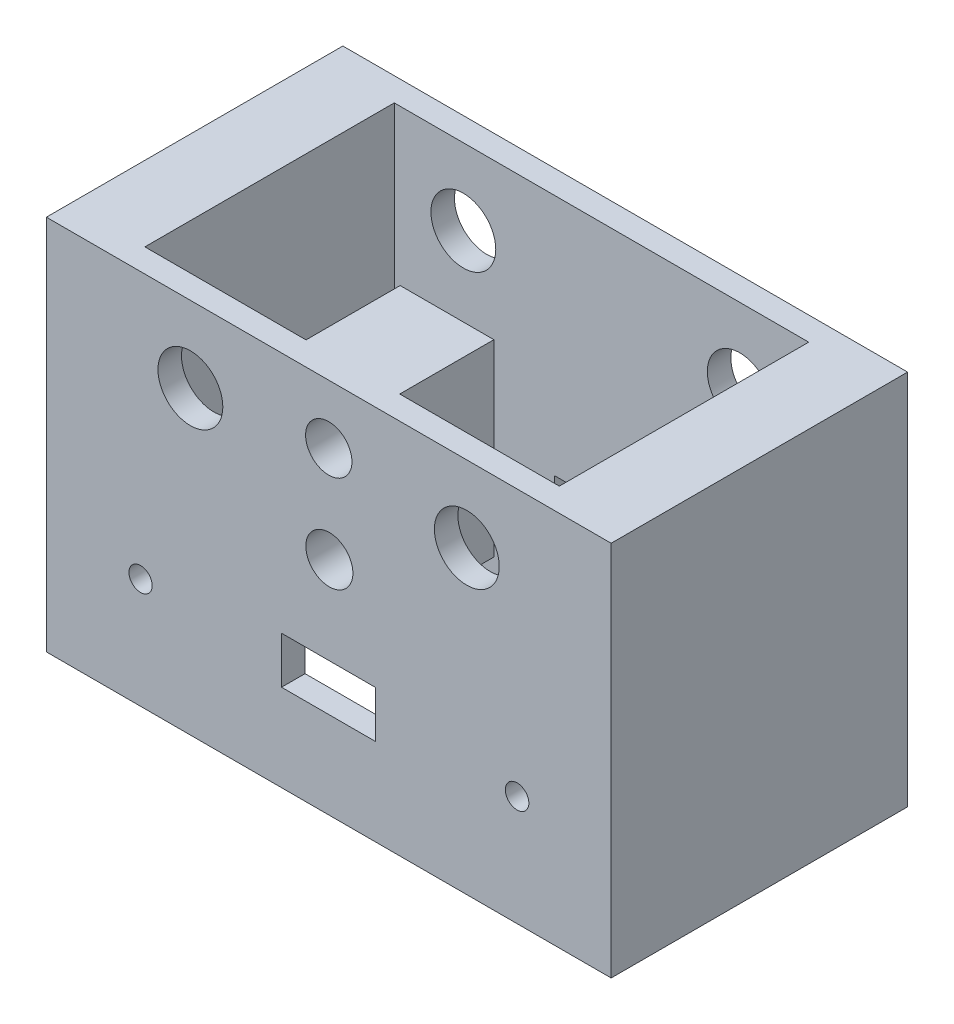
ISO-10303-21;
HEADER;
FILE_DESCRIPTION(('STEP AP214'),'2;1');
FILE_NAME('part.step','',(''),(''),'','','');
FILE_SCHEMA(('AUTOMOTIVE_DESIGN { 1 0 10303 214 1 1 1 1 }'));
ENDSEC;
DATA;
#1=APPLICATION_CONTEXT('core data for automotive mechanical design processes');
#2=APPLICATION_PROTOCOL_DEFINITION('international standard','automotive_design',2000,#1);
#3=PRODUCT_CONTEXT('',#1,'mechanical');
#4=PRODUCT('Part','Part','',(#3));
#5=PRODUCT_RELATED_PRODUCT_CATEGORY('part','',(#4));
#6=PRODUCT_DEFINITION_FORMATION('','',#4);
#7=PRODUCT_DEFINITION_CONTEXT('part definition',#1,'design');
#8=PRODUCT_DEFINITION('design','',#6,#7);
#9=PRODUCT_DEFINITION_SHAPE('','',#8);
#10=(LENGTH_UNIT() NAMED_UNIT(*) SI_UNIT(.MILLI.,.METRE.));
#11=(NAMED_UNIT(*) PLANE_ANGLE_UNIT() SI_UNIT($,.RADIAN.));
#12=(NAMED_UNIT(*) SI_UNIT($,.STERADIAN.) SOLID_ANGLE_UNIT());
#13=UNCERTAINTY_MEASURE_WITH_UNIT(LENGTH_MEASURE(1.E-05),#10,'distance_accuracy_value','');
#14=(GEOMETRIC_REPRESENTATION_CONTEXT(3) GLOBAL_UNCERTAINTY_ASSIGNED_CONTEXT((#13)) GLOBAL_UNIT_ASSIGNED_CONTEXT((#10,
#11,#12)) REPRESENTATION_CONTEXT('',''));
#15=CARTESIAN_POINT('',(0.,0.,0.));
#16=DIRECTION('',(0.,0.,1.));
#17=DIRECTION('',(1.,0.,0.));
#18=AXIS2_PLACEMENT_3D('',#15,#16,#17);
#19=CARTESIAN_POINT('',(0.,-78.2220939999999,73.650094));
#20=DIRECTION('',(0.,0.,-1.));
#21=DIRECTION('',(-1.,0.,0.));
#22=AXIS2_PLACEMENT_3D('',#19,#20,#21);
#23=PLANE('',#22);
#24=CARTESIAN_POINT('',(-38.9521336608494,81.0613510847149,73.650094));
#25=DIRECTION('',(0.,0.,-1.));
#26=DIRECTION('',(-1.,0.,0.));
#27=AXIS2_PLACEMENT_3D('',#24,#25,#26);
#28=CIRCLE('',#27,8.75000028);
#29=CARTESIAN_POINT('',(-47.7021339408494,81.0613510847149,73.650094));
#30=VERTEX_POINT('',#29);
#31=EDGE_CURVE('E280',#30,#30,#28,.T.);
#32=ORIENTED_EDGE('',*,*,#31,.F.);
#33=EDGE_LOOP('',(#32));
#34=FACE_BOUND('',#33,.T.);
#35=CARTESIAN_POINT('',(-126.984472283822,29.7454237704598,73.650094));
#36=DIRECTION('',(0.,0.,-1.));
#37=DIRECTION('',(-1.,0.,0.));
#38=AXIS2_PLACEMENT_3D('',#35,#36,#37);
#39=CIRCLE('',#38,3.14221906512558);
#40=CARTESIAN_POINT('',(-130.126691348948,29.7454237704598,73.650094));
#41=VERTEX_POINT('',#40);
#42=EDGE_CURVE('E277',#41,#41,#39,.T.);
#43=ORIENTED_EDGE('',*,*,#42,.F.);
#44=EDGE_LOOP('',(#43));
#45=FACE_BOUND('',#44,.T.);
#46=CARTESIAN_POINT('',(-113.538,81.0613510847149,73.650094));
#47=DIRECTION('',(0.,0.,-1.));
#48=DIRECTION('',(-1.,0.,0.));
#49=AXIS2_PLACEMENT_3D('',#46,#47,#48);
#50=CIRCLE('',#49,8.75000028);
#51=CARTESIAN_POINT('',(-122.28800028,81.0613510847149,73.650094));
#52=VERTEX_POINT('',#51);
#53=EDGE_CURVE('E45',#52,#52,#50,.T.);
#54=ORIENTED_EDGE('',*,*,#53,.F.);
#55=EDGE_LOOP('',(#54));
#56=FACE_BOUND('',#55,.T.);
#57=CARTESIAN_POINT('',(-25.3844722838221,29.7454237704598,73.650094));
#58=DIRECTION('',(0.,0.,-1.));
#59=DIRECTION('',(-1.,0.,0.));
#60=AXIS2_PLACEMENT_3D('',#57,#58,#59);
#61=CIRCLE('',#60,3.175);
#62=CARTESIAN_POINT('',(-28.5594722838221,29.7454237704598,73.650094));
#63=VERTEX_POINT('',#62);
#64=EDGE_CURVE('E266',#63,#63,#61,.T.);
#65=ORIENTED_EDGE('',*,*,#64,.F.);
#66=EDGE_LOOP('',(#65));
#67=FACE_BOUND('',#66,.T.);
#68=DIRECTION('',(0.,1.,0.));
#69=VECTOR('',#68,1.);
#70=CARTESIAN_POINT('',(-63.55152701539,0.,73.650094));
#71=LINE('',#70,#69);
#72=CARTESIAN_POINT('',(-63.55152701539,23.4769759113968,73.650094));
#73=VERTEX_POINT('',#72);
#74=CARTESIAN_POINT('',(-63.55152701539,36.1065054441596,73.650094));
#75=VERTEX_POINT('',#74);
#76=EDGE_CURVE('E275',#73,#75,#71,.T.);
#77=ORIENTED_EDGE('',*,*,#76,.T.);
#78=DIRECTION('',(-1.,0.,0.));
#79=VECTOR('',#78,1.);
#80=CARTESIAN_POINT('',(0.,36.1065054441596,73.650094));
#81=LINE('',#80,#79);
#82=CARTESIAN_POINT('',(-88.9467535152311,36.1065054441596,73.650094));
#83=VERTEX_POINT('',#82);
#84=EDGE_CURVE('E269',#75,#83,#81,.T.);
#85=ORIENTED_EDGE('',*,*,#84,.T.);
#86=DIRECTION('',(0.,-1.,0.));
#87=VECTOR('',#86,1.);
#88=CARTESIAN_POINT('',(-88.9467535152311,0.,73.650094));
#89=LINE('',#88,#87);
#90=CARTESIAN_POINT('',(-88.9467535152311,23.4769759113968,73.650094));
#91=VERTEX_POINT('',#90);
#92=EDGE_CURVE('E271',#83,#91,#89,.T.);
#93=ORIENTED_EDGE('',*,*,#92,.T.);
#94=DIRECTION('',(1.,0.,0.));
#95=VECTOR('',#94,1.);
#96=CARTESIAN_POINT('',(0.,23.4769759113968,73.650094));
#97=LINE('',#96,#95);
#98=EDGE_CURVE('E273',#91,#73,#97,.T.);
#99=ORIENTED_EDGE('',*,*,#98,.T.);
#100=EDGE_LOOP('',(#77,#85,#93,#99));
#101=FACE_BOUND('',#100,.T.);
#102=DIRECTION('',(-1.,0.,0.));
#103=VECTOR('',#102,1.);
#104=CARTESIAN_POINT('',(-63.3975606956987,50.8,73.650094));
#105=LINE('',#104,#103);
#106=CARTESIAN_POINT('',(-63.3975606956987,50.8,73.650094));
#107=VERTEX_POINT('',#106);
#108=CARTESIAN_POINT('',(-88.6850234537815,50.8,73.650094));
#109=VERTEX_POINT('',#108);
#110=EDGE_CURVE('E216',#107,#109,#105,.T.);
#111=ORIENTED_EDGE('',*,*,#110,.F.);
#112=DIRECTION('',(0.,-1.,0.));
#113=VECTOR('',#112,1.);
#114=CARTESIAN_POINT('',(-63.3975606956987,101.6,73.650094));
#115=LINE('',#114,#113);
#116=CARTESIAN_POINT('',(-63.3975606956987,101.6,73.650094));
#117=VERTEX_POINT('',#116);
#118=EDGE_CURVE('E214',#117,#107,#115,.T.);
#119=ORIENTED_EDGE('',*,*,#118,.F.);
#120=DIRECTION('',(-1.,0.,0.));
#121=VECTOR('',#120,1.);
#122=CARTESIAN_POINT('',(0.,101.6,73.650094));
#123=LINE('',#122,#121);
#124=CARTESIAN_POINT('',(-20.3348103085033,101.6,73.650094));
#125=VERTEX_POINT('',#124);
#126=EDGE_CURVE('E198',#125,#117,#123,.T.);
#127=ORIENTED_EDGE('',*,*,#126,.F.);
#128=DIRECTION('',(0.,1.,0.));
#129=VECTOR('',#128,1.);
#130=CARTESIAN_POINT('',(-20.3348103085033,-78.2220939999999,73.650094));
#131=LINE('',#130,#129);
#132=CARTESIAN_POINT('',(-20.3348103085033,0.,73.650094));
#133=VERTEX_POINT('',#132);
#134=EDGE_CURVE('E238',#133,#125,#131,.T.);
#135=ORIENTED_EDGE('',*,*,#134,.F.);
#136=DIRECTION('',(-1.,0.,0.));
#137=VECTOR('',#136,1.);
#138=CARTESIAN_POINT('',(0.,0.,73.650094));
#139=LINE('',#138,#137);
#140=CARTESIAN_POINT('',(-132.170994975003,0.,73.650094));
#141=VERTEX_POINT('',#140);
#142=EDGE_CURVE('E283',#133,#141,#139,.T.);
#143=ORIENTED_EDGE('',*,*,#142,.T.);
#144=DIRECTION('',(0.,1.,0.));
#145=VECTOR('',#144,1.);
#146=CARTESIAN_POINT('',(-132.170994975003,-78.2220939999999,73.650094));
#147=LINE('',#146,#145);
#148=CARTESIAN_POINT('',(-132.170994975003,101.6,73.650094));
#149=VERTEX_POINT('',#148);
#150=EDGE_CURVE('E241',#141,#149,#147,.T.);
#151=ORIENTED_EDGE('',*,*,#150,.T.);
#152=CARTESIAN_POINT('',(-88.6850234537815,101.6,73.650094));
#153=VERTEX_POINT('',#152);
#154=EDGE_CURVE('E235',#153,#149,#123,.T.);
#155=ORIENTED_EDGE('',*,*,#154,.F.);
#156=DIRECTION('',(0.,1.,0.));
#157=VECTOR('',#156,1.);
#158=CARTESIAN_POINT('',(-88.6850234537815,50.8,73.650094));
#159=LINE('',#158,#157);
#160=EDGE_CURVE('E190',#109,#153,#159,.T.);
#161=ORIENTED_EDGE('',*,*,#160,.F.);
#162=EDGE_LOOP('',(#111,#119,#127,#135,#143,#151,#155,#161));
#163=FACE_BOUND('',#162,.T.);
#164=ADVANCED_FACE('F41',(#34,#45,#56,#67,#101,#163),#23,.T.);
#165=CARTESIAN_POINT('',(0.,0.,80.000094));
#166=DIRECTION('',(0.,1.,0.));
#167=DIRECTION('',(0.,0.,1.));
#168=AXIS2_PLACEMENT_3D('',#165,#166,#167);
#169=PLANE('',#168);
#170=DIRECTION('',(1.,0.,0.));
#171=VECTOR('',#170,1.);
#172=CARTESIAN_POINT('',(0.,0.,0.));
#173=LINE('',#172,#171);
#174=CARTESIAN_POINT('',(-152.4,0.,0.));
#175=VERTEX_POINT('',#174);
#176=CARTESIAN_POINT('',(0.,0.,0.));
#177=VERTEX_POINT('',#176);
#178=EDGE_CURVE('E340',#175,#177,#173,.T.);
#179=ORIENTED_EDGE('',*,*,#178,.T.);
#180=DIRECTION('',(0.,0.,-1.));
#181=VECTOR('',#180,1.);
#182=CARTESIAN_POINT('',(0.,0.,80.000094));
#183=LINE('',#182,#181);
#184=CARTESIAN_POINT('',(0.,0.,80.000094));
#185=VERTEX_POINT('',#184);
#186=EDGE_CURVE('E11',#185,#177,#183,.T.);
#187=ORIENTED_EDGE('',*,*,#186,.F.);
#188=DIRECTION('',(1.,0.,0.));
#189=VECTOR('',#188,1.);
#190=CARTESIAN_POINT('',(0.,0.,80.000094));
#191=LINE('',#190,#189);
#192=CARTESIAN_POINT('',(-152.4,0.,80.000094));
#193=VERTEX_POINT('',#192);
#194=EDGE_CURVE('E306',#193,#185,#191,.T.);
#195=ORIENTED_EDGE('',*,*,#194,.F.);
#196=DIRECTION('',(0.,0.,-1.));
#197=VECTOR('',#196,1.);
#198=CARTESIAN_POINT('',(-152.4,0.,80.000094));
#199=LINE('',#198,#197);
#200=EDGE_CURVE('E356',#193,#175,#199,.T.);
#201=ORIENTED_EDGE('',*,*,#200,.T.);
#202=EDGE_LOOP('',(#179,#187,#195,#201));
#203=FACE_BOUND('',#202,.T.);
#204=DIRECTION('',(0.,0.,1.));
#205=VECTOR('',#204,1.);
#206=CARTESIAN_POINT('',(-20.3348103085033,0.,80.000094));
#207=LINE('',#206,#205);
#208=CARTESIAN_POINT('',(-20.3348103085033,0.,6.34999999999999));
#209=VERTEX_POINT('',#208);
#210=EDGE_CURVE('E287',#209,#133,#207,.T.);
#211=ORIENTED_EDGE('',*,*,#210,.F.);
#212=DIRECTION('',(1.,0.,0.));
#213=VECTOR('',#212,1.);
#214=CARTESIAN_POINT('',(0.,0.,6.34999999999999));
#215=LINE('',#214,#213);
#216=CARTESIAN_POINT('',(-132.170994975003,0.,6.34999999999999));
#217=VERTEX_POINT('',#216);
#218=EDGE_CURVE('E264',#217,#209,#215,.T.);
#219=ORIENTED_EDGE('',*,*,#218,.F.);
#220=DIRECTION('',(0.,0.,-1.));
#221=VECTOR('',#220,1.);
#222=CARTESIAN_POINT('',(-132.170994975003,0.,80.000094));
#223=LINE('',#222,#221);
#224=EDGE_CURVE('E285',#141,#217,#223,.T.);
#225=ORIENTED_EDGE('',*,*,#224,.F.);
#226=ORIENTED_EDGE('',*,*,#142,.F.);
#227=EDGE_LOOP('',(#211,#219,#225,#226));
#228=FACE_BOUND('',#227,.T.);
#229=ADVANCED_FACE('F400',(#203,#228),#169,.F.);
#230=CARTESIAN_POINT('',(0.,101.6,80.000094));
#231=DIRECTION('',(0.,1.,0.));
#232=DIRECTION('',(0.,0.,1.));
#233=AXIS2_PLACEMENT_3D('',#230,#231,#232);
#234=PLANE('',#233);
#235=DIRECTION('',(1.,0.,0.));
#236=VECTOR('',#235,1.);
#237=CARTESIAN_POINT('',(0.,101.6,0.));
#238=LINE('',#237,#236);
#239=CARTESIAN_POINT('',(-152.4,101.6,0.));
#240=VERTEX_POINT('',#239);
#241=CARTESIAN_POINT('',(0.,101.6,0.));
#242=VERTEX_POINT('',#241);
#243=EDGE_CURVE('E346',#240,#242,#238,.T.);
#244=ORIENTED_EDGE('',*,*,#243,.F.);
#245=DIRECTION('',(0.,0.,-1.));
#246=VECTOR('',#245,1.);
#247=CARTESIAN_POINT('',(-152.4,101.6,80.000094));
#248=LINE('',#247,#246);
#249=CARTESIAN_POINT('',(-152.4,101.6,80.000094));
#250=VERTEX_POINT('',#249);
#251=EDGE_CURVE('E359',#250,#240,#248,.T.);
#252=ORIENTED_EDGE('',*,*,#251,.F.);
#253=DIRECTION('',(1.,0.,0.));
#254=VECTOR('',#253,1.);
#255=CARTESIAN_POINT('',(0.,101.6,80.000094));
#256=LINE('',#255,#254);
#257=CARTESIAN_POINT('',(0.,101.6,80.000094));
#258=VERTEX_POINT('',#257);
#259=EDGE_CURVE('E311',#250,#258,#256,.T.);
#260=ORIENTED_EDGE('',*,*,#259,.T.);
#261=DIRECTION('',(0.,0.,-1.));
#262=VECTOR('',#261,1.);
#263=CARTESIAN_POINT('',(0.,101.6,80.000094));
#264=LINE('',#263,#262);
#265=EDGE_CURVE('E50',#258,#242,#264,.T.);
#266=ORIENTED_EDGE('',*,*,#265,.T.);
#267=EDGE_LOOP('',(#244,#252,#260,#266));
#268=FACE_BOUND('',#267,.T.);
#269=DIRECTION('',(1.,0.,0.));
#270=VECTOR('',#269,1.);
#271=CARTESIAN_POINT('',(0.,101.6,6.34999999999999));
#272=LINE('',#271,#270);
#273=CARTESIAN_POINT('',(-132.170994975003,101.6,6.34999999999999));
#274=VERTEX_POINT('',#273);
#275=CARTESIAN_POINT('',(-20.3348103085033,101.6,6.34999999999999));
#276=VERTEX_POINT('',#275);
#277=EDGE_CURVE('E230',#274,#276,#272,.T.);
#278=ORIENTED_EDGE('',*,*,#277,.T.);
#279=DIRECTION('',(0.,0.,1.));
#280=VECTOR('',#279,1.);
#281=CARTESIAN_POINT('',(-20.3348103085033,101.6,0.));
#282=LINE('',#281,#280);
#283=EDGE_CURVE('E228',#276,#125,#282,.T.);
#284=ORIENTED_EDGE('',*,*,#283,.T.);
#285=ORIENTED_EDGE('',*,*,#126,.T.);
#286=DIRECTION('',(0.,0.,1.));
#287=VECTOR('',#286,1.);
#288=CARTESIAN_POINT('',(-63.3975606956987,101.6,48.250094));
#289=LINE('',#288,#287);
#290=CARTESIAN_POINT('',(-63.3975606956987,101.6,48.250094));
#291=VERTEX_POINT('',#290);
#292=EDGE_CURVE('E193',#291,#117,#289,.T.);
#293=ORIENTED_EDGE('',*,*,#292,.F.);
#294=DIRECTION('',(1.,0.,0.));
#295=VECTOR('',#294,1.);
#296=CARTESIAN_POINT('',(-88.6850234537815,101.6,48.250094));
#297=LINE('',#296,#295);
#298=CARTESIAN_POINT('',(-88.6850234537815,101.6,48.250094));
#299=VERTEX_POINT('',#298);
#300=EDGE_CURVE('E179',#299,#291,#297,.T.);
#301=ORIENTED_EDGE('',*,*,#300,.F.);
#302=DIRECTION('',(0.,0.,1.));
#303=VECTOR('',#302,1.);
#304=CARTESIAN_POINT('',(-88.6850234537815,101.6,48.250094));
#305=LINE('',#304,#303);
#306=EDGE_CURVE('E213',#299,#153,#305,.T.);
#307=ORIENTED_EDGE('',*,*,#306,.T.);
#308=ORIENTED_EDGE('',*,*,#154,.T.);
#309=DIRECTION('',(0.,0.,-1.));
#310=VECTOR('',#309,1.);
#311=CARTESIAN_POINT('',(-132.170994975003,101.6,0.));
#312=LINE('',#311,#310);
#313=EDGE_CURVE('E232',#149,#274,#312,.T.);
#314=ORIENTED_EDGE('',*,*,#313,.T.);
#315=EDGE_LOOP('',(#278,#284,#285,#293,#301,#307,#308,#314));
#316=FACE_BOUND('',#315,.T.);
#317=ADVANCED_FACE('F195',(#268,#316),#234,.T.);
#318=CARTESIAN_POINT('',(-63.55152701539,0.,80.000094));
#319=DIRECTION('',(1.,0.,0.));
#320=DIRECTION('',(0.,0.,-1.));
#321=AXIS2_PLACEMENT_3D('',#318,#319,#320);
#322=PLANE('',#321);
#323=ORIENTED_EDGE('',*,*,#76,.F.);
#324=DIRECTION('',(0.,0.,-1.));
#325=VECTOR('',#324,1.);
#326=CARTESIAN_POINT('',(-63.55152701539,23.4769759113968,80.000094));
#327=LINE('',#326,#325);
#328=CARTESIAN_POINT('',(-63.55152701539,23.4769759113968,80.000094));
#329=VERTEX_POINT('',#328);
#330=EDGE_CURVE('E360',#329,#73,#327,.T.);
#331=ORIENTED_EDGE('',*,*,#330,.F.);
#332=DIRECTION('',(0.,-1.,0.));
#333=VECTOR('',#332,1.);
#334=CARTESIAN_POINT('',(-63.55152701539,0.,80.000094));
#335=LINE('',#334,#333);
#336=CARTESIAN_POINT('',(-63.55152701539,36.1065054441596,80.000094));
#337=VERTEX_POINT('',#336);
#338=EDGE_CURVE('E293',#337,#329,#335,.T.);
#339=ORIENTED_EDGE('',*,*,#338,.F.);
#340=DIRECTION('',(0.,0.,-1.));
#341=VECTOR('',#340,1.);
#342=CARTESIAN_POINT('',(-63.55152701539,36.1065054441596,80.000094));
#343=LINE('',#342,#341);
#344=EDGE_CURVE('E363',#337,#75,#343,.T.);
#345=ORIENTED_EDGE('',*,*,#344,.T.);
#346=EDGE_LOOP('',(#323,#331,#339,#345));
#347=FACE_BOUND('',#346,.T.);
#348=ADVANCED_FACE('F461',(#347),#322,.F.);
#349=DIRECTION('',(0.,-1.,0.));
#350=VECTOR('',#349,1.);
#351=CARTESIAN_POINT('',(-63.55152701539,0.,6.34999999999999));
#352=LINE('',#351,#350);
#353=CARTESIAN_POINT('',(-63.55152701539,36.1065054441596,6.34999999999999));
#354=VERTEX_POINT('',#353);
#355=CARTESIAN_POINT('',(-63.55152701539,23.4769759113968,6.34999999999999));
#356=VERTEX_POINT('',#355);
#357=EDGE_CURVE('E256',#354,#356,#352,.T.);
#358=ORIENTED_EDGE('',*,*,#357,.F.);
#359=CARTESIAN_POINT('',(-63.55152701539,36.1065054441596,0.));
#360=VERTEX_POINT('',#359);
#361=EDGE_CURVE('E322',#354,#360,#343,.T.);
#362=ORIENTED_EDGE('',*,*,#361,.T.);
#363=DIRECTION('',(0.,-1.,0.));
#364=VECTOR('',#363,1.);
#365=CARTESIAN_POINT('',(-63.55152701539,0.,0.));
#366=LINE('',#365,#364);
#367=CARTESIAN_POINT('',(-63.55152701539,23.4769759113968,0.));
#368=VERTEX_POINT('',#367);
#369=EDGE_CURVE('E325',#360,#368,#366,.T.);
#370=ORIENTED_EDGE('',*,*,#369,.T.);
#371=EDGE_CURVE('E374',#356,#368,#327,.T.);
#372=ORIENTED_EDGE('',*,*,#371,.F.);
#373=EDGE_LOOP('',(#358,#362,#370,#372));
#374=FACE_BOUND('',#373,.T.);
#375=ADVANCED_FACE('F483',(#374),#322,.F.);
#376=CARTESIAN_POINT('',(0.,23.4769759113968,80.000094));
#377=DIRECTION('',(0.,-1.,0.));
#378=DIRECTION('',(0.,0.,-1.));
#379=AXIS2_PLACEMENT_3D('',#376,#377,#378);
#380=PLANE('',#379);
#381=ORIENTED_EDGE('',*,*,#98,.F.);
#382=DIRECTION('',(0.,0.,-1.));
#383=VECTOR('',#382,1.);
#384=CARTESIAN_POINT('',(-88.9467535152311,23.4769759113968,80.000094));
#385=LINE('',#384,#383);
#386=CARTESIAN_POINT('',(-88.9467535152311,23.4769759113968,80.000094));
#387=VERTEX_POINT('',#386);
#388=EDGE_CURVE('E371',#387,#91,#385,.T.);
#389=ORIENTED_EDGE('',*,*,#388,.F.);
#390=DIRECTION('',(-1.,0.,0.));
#391=VECTOR('',#390,1.);
#392=CARTESIAN_POINT('',(0.,23.4769759113968,80.000094));
#393=LINE('',#392,#391);
#394=EDGE_CURVE('E297',#329,#387,#393,.T.);
#395=ORIENTED_EDGE('',*,*,#394,.F.);
#396=ORIENTED_EDGE('',*,*,#330,.T.);
#397=EDGE_LOOP('',(#381,#389,#395,#396));
#398=FACE_BOUND('',#397,.T.);
#399=ADVANCED_FACE('F481',(#398),#380,.F.);
#400=DIRECTION('',(-1.,0.,0.));
#401=VECTOR('',#400,1.);
#402=CARTESIAN_POINT('',(0.,23.4769759113968,6.34999999999999));
#403=LINE('',#402,#401);
#404=CARTESIAN_POINT('',(-88.9467535152311,23.4769759113968,6.34999999999999));
#405=VERTEX_POINT('',#404);
#406=EDGE_CURVE('E254',#356,#405,#403,.T.);
#407=ORIENTED_EDGE('',*,*,#406,.F.);
#408=ORIENTED_EDGE('',*,*,#371,.T.);
#409=DIRECTION('',(-1.,0.,0.));
#410=VECTOR('',#409,1.);
#411=CARTESIAN_POINT('',(0.,23.4769759113968,0.));
#412=LINE('',#411,#410);
#413=CARTESIAN_POINT('',(-88.9467535152311,23.4769759113968,0.));
#414=VERTEX_POINT('',#413);
#415=EDGE_CURVE('E328',#368,#414,#412,.T.);
#416=ORIENTED_EDGE('',*,*,#415,.T.);
#417=EDGE_CURVE('E370',#405,#414,#385,.T.);
#418=ORIENTED_EDGE('',*,*,#417,.F.);
#419=EDGE_LOOP('',(#407,#408,#416,#418));
#420=FACE_BOUND('',#419,.T.);
#421=ADVANCED_FACE('F479',(#420),#380,.F.);
#422=CARTESIAN_POINT('',(-88.9467535152311,0.,80.000094));
#423=DIRECTION('',(-1.,0.,0.));
#424=DIRECTION('',(0.,0.,1.));
#425=AXIS2_PLACEMENT_3D('',#422,#423,#424);
#426=PLANE('',#425);
#427=ORIENTED_EDGE('',*,*,#92,.F.);
#428=DIRECTION('',(0.,0.,-1.));
#429=VECTOR('',#428,1.);
#430=CARTESIAN_POINT('',(-88.9467535152311,36.1065054441596,80.000094));
#431=LINE('',#430,#429);
#432=CARTESIAN_POINT('',(-88.9467535152311,36.1065054441596,80.000094));
#433=VERTEX_POINT('',#432);
#434=EDGE_CURVE('E367',#433,#83,#431,.T.);
#435=ORIENTED_EDGE('',*,*,#434,.F.);
#436=DIRECTION('',(0.,1.,0.));
#437=VECTOR('',#436,1.);
#438=CARTESIAN_POINT('',(-88.9467535152311,0.,80.000094));
#439=LINE('',#438,#437);
#440=EDGE_CURVE('E299',#387,#433,#439,.T.);
#441=ORIENTED_EDGE('',*,*,#440,.F.);
#442=ORIENTED_EDGE('',*,*,#388,.T.);
#443=EDGE_LOOP('',(#427,#435,#441,#442));
#444=FACE_BOUND('',#443,.T.);
#445=ADVANCED_FACE('F476',(#444),#426,.F.);
#446=DIRECTION('',(0.,1.,0.));
#447=VECTOR('',#446,1.);
#448=CARTESIAN_POINT('',(-88.9467535152311,0.,6.34999999999999));
#449=LINE('',#448,#447);
#450=CARTESIAN_POINT('',(-88.9467535152311,36.1065054441596,6.34999999999999));
#451=VERTEX_POINT('',#450);
#452=EDGE_CURVE('E252',#405,#451,#449,.T.);
#453=ORIENTED_EDGE('',*,*,#452,.F.);
#454=ORIENTED_EDGE('',*,*,#417,.T.);
#455=DIRECTION('',(0.,1.,0.));
#456=VECTOR('',#455,1.);
#457=CARTESIAN_POINT('',(-88.9467535152311,0.,0.));
#458=LINE('',#457,#456);
#459=CARTESIAN_POINT('',(-88.9467535152311,36.1065054441596,0.));
#460=VERTEX_POINT('',#459);
#461=EDGE_CURVE('E331',#414,#460,#458,.T.);
#462=ORIENTED_EDGE('',*,*,#461,.T.);
#463=EDGE_CURVE('E366',#451,#460,#431,.T.);
#464=ORIENTED_EDGE('',*,*,#463,.F.);
#465=EDGE_LOOP('',(#453,#454,#462,#464));
#466=FACE_BOUND('',#465,.T.);
#467=ADVANCED_FACE('F454',(#466),#426,.F.);
#468=CARTESIAN_POINT('',(-38.9521336608494,81.0613510847149,80.000094));
#469=DIRECTION('',(0.,0.,-1.));
#470=DIRECTION('',(-1.,0.,0.));
#471=AXIS2_PLACEMENT_3D('',#468,#469,#470);
#472=CYLINDRICAL_SURFACE('',#471,8.75000028);
#473=CARTESIAN_POINT('',(-38.9521336608494,81.0613510847149,80.000094));
#474=DIRECTION('',(0.,0.,1.));
#475=DIRECTION('',(1.,0.,0.));
#476=AXIS2_PLACEMENT_3D('',#473,#474,#475);
#477=CIRCLE('',#476,8.75000028);
#478=CARTESIAN_POINT('',(-30.2021333808495,81.0613510847149,80.000094));
#479=VERTEX_POINT('',#478);
#480=EDGE_CURVE('E316',#479,#479,#477,.T.);
#481=ORIENTED_EDGE('',*,*,#480,.T.);
#482=EDGE_LOOP('',(#481));
#483=FACE_BOUND('',#482,.T.);
#484=ORIENTED_EDGE('',*,*,#31,.T.);
#485=EDGE_LOOP('',(#484));
#486=FACE_BOUND('',#485,.T.);
#487=ADVANCED_FACE('F450',(#483,#486),#472,.F.);
#488=CARTESIAN_POINT('',(-38.9521336608494,81.0613510847149,0.));
#489=DIRECTION('',(0.,0.,1.));
#490=DIRECTION('',(1.,0.,0.));
#491=AXIS2_PLACEMENT_3D('',#488,#489,#490);
#492=CIRCLE('',#491,8.75000028);
#493=CARTESIAN_POINT('',(-30.2021333808495,81.0613510847149,0.));
#494=VERTEX_POINT('',#493);
#495=EDGE_CURVE('E351',#494,#494,#492,.T.);
#496=ORIENTED_EDGE('',*,*,#495,.F.);
#497=EDGE_LOOP('',(#496));
#498=FACE_BOUND('',#497,.T.);
#499=CARTESIAN_POINT('',(-38.9521336608494,81.0613510847149,6.34999999999999));
#500=DIRECTION('',(0.,0.,1.));
#501=DIRECTION('',(1.,0.,0.));
#502=AXIS2_PLACEMENT_3D('',#499,#500,#501);
#503=CIRCLE('',#502,8.75000028);
#504=CARTESIAN_POINT('',(-30.2021333808495,81.0613510847149,6.34999999999999));
#505=VERTEX_POINT('',#504);
#506=EDGE_CURVE('E261',#505,#505,#503,.T.);
#507=ORIENTED_EDGE('',*,*,#506,.T.);
#508=EDGE_LOOP('',(#507));
#509=FACE_BOUND('',#508,.T.);
#510=ADVANCED_FACE('F453',(#498,#509),#472,.F.);
#511=CARTESIAN_POINT('',(-126.984472283822,29.7454237704598,80.000094));
#512=DIRECTION('',(0.,0.,-1.));
#513=DIRECTION('',(-1.,0.,0.));
#514=AXIS2_PLACEMENT_3D('',#511,#512,#513);
#515=CYLINDRICAL_SURFACE('',#514,3.14221906512558);
#516=CARTESIAN_POINT('',(-126.984472283822,29.7454237704598,80.000094));
#517=DIRECTION('',(0.,0.,1.));
#518=DIRECTION('',(1.,0.,0.));
#519=AXIS2_PLACEMENT_3D('',#516,#517,#518);
#520=CIRCLE('',#519,3.14221906512558);
#521=CARTESIAN_POINT('',(-123.842253218697,29.7454237704598,80.000094));
#522=VERTEX_POINT('',#521);
#523=EDGE_CURVE('E303',#522,#522,#520,.T.);
#524=ORIENTED_EDGE('',*,*,#523,.T.);
#525=EDGE_LOOP('',(#524));
#526=FACE_BOUND('',#525,.T.);
#527=ORIENTED_EDGE('',*,*,#42,.T.);
#528=EDGE_LOOP('',(#527));
#529=FACE_BOUND('',#528,.T.);
#530=ADVANCED_FACE('F466',(#526,#529),#515,.F.);
#531=CARTESIAN_POINT('',(-126.984472283822,29.7454237704598,0.));
#532=DIRECTION('',(0.,0.,1.));
#533=DIRECTION('',(1.,0.,0.));
#534=AXIS2_PLACEMENT_3D('',#531,#532,#533);
#535=CIRCLE('',#534,3.14221906512558);
#536=CARTESIAN_POINT('',(-123.842253218697,29.7454237704598,0.));
#537=VERTEX_POINT('',#536);
#538=EDGE_CURVE('E337',#537,#537,#535,.T.);
#539=ORIENTED_EDGE('',*,*,#538,.F.);
#540=EDGE_LOOP('',(#539));
#541=FACE_BOUND('',#540,.T.);
#542=CARTESIAN_POINT('',(-126.984472283822,29.7454237704598,6.34999999999999));
#543=DIRECTION('',(0.,0.,1.));
#544=DIRECTION('',(1.,0.,0.));
#545=AXIS2_PLACEMENT_3D('',#542,#543,#544);
#546=CIRCLE('',#545,3.14221906512558);
#547=CARTESIAN_POINT('',(-123.842253218697,29.7454237704598,6.34999999999999));
#548=VERTEX_POINT('',#547);
#549=EDGE_CURVE('E258',#548,#548,#546,.T.);
#550=ORIENTED_EDGE('',*,*,#549,.T.);
#551=EDGE_LOOP('',(#550));
#552=FACE_BOUND('',#551,.T.);
#553=ADVANCED_FACE('F469',(#541,#552),#515,.F.);
#554=CARTESIAN_POINT('',(0.,36.1065054441596,80.000094));
#555=DIRECTION('',(0.,1.,0.));
#556=DIRECTION('',(0.,0.,1.));
#557=AXIS2_PLACEMENT_3D('',#554,#555,#556);
#558=PLANE('',#557);
#559=ORIENTED_EDGE('',*,*,#84,.F.);
#560=ORIENTED_EDGE('',*,*,#344,.F.);
#561=DIRECTION('',(1.,0.,0.));
#562=VECTOR('',#561,1.);
#563=CARTESIAN_POINT('',(0.,36.1065054441596,80.000094));
#564=LINE('',#563,#562);
#565=EDGE_CURVE('E301',#433,#337,#564,.T.);
#566=ORIENTED_EDGE('',*,*,#565,.F.);
#567=ORIENTED_EDGE('',*,*,#434,.T.);
#568=EDGE_LOOP('',(#559,#560,#566,#567));
#569=FACE_BOUND('',#568,.T.);
#570=ADVANCED_FACE('F471',(#569),#558,.F.);
#571=DIRECTION('',(1.,0.,0.));
#572=VECTOR('',#571,1.);
#573=CARTESIAN_POINT('',(0.,36.1065054441596,6.34999999999999));
#574=LINE('',#573,#572);
#575=EDGE_CURVE('E250',#451,#354,#574,.T.);
#576=ORIENTED_EDGE('',*,*,#575,.F.);
#577=ORIENTED_EDGE('',*,*,#463,.T.);
#578=DIRECTION('',(1.,0.,0.));
#579=VECTOR('',#578,1.);
#580=CARTESIAN_POINT('',(0.,36.1065054441596,0.));
#581=LINE('',#580,#579);
#582=EDGE_CURVE('E334',#460,#360,#581,.T.);
#583=ORIENTED_EDGE('',*,*,#582,.T.);
#584=ORIENTED_EDGE('',*,*,#361,.F.);
#585=EDGE_LOOP('',(#576,#577,#583,#584));
#586=FACE_BOUND('',#585,.T.);
#587=ADVANCED_FACE('F474',(#586),#558,.F.);
#588=CARTESIAN_POINT('',(-25.3844722838221,29.7454237704598,80.000094));
#589=DIRECTION('',(0.,0.,-1.));
#590=DIRECTION('',(-1.,0.,0.));
#591=AXIS2_PLACEMENT_3D('',#588,#589,#590);
#592=CYLINDRICAL_SURFACE('',#591,3.175);
#593=CARTESIAN_POINT('',(-25.3844722838221,29.7454237704598,80.000094));
#594=DIRECTION('',(0.,0.,1.));
#595=DIRECTION('',(1.,0.,0.));
#596=AXIS2_PLACEMENT_3D('',#593,#594,#595);
#597=CIRCLE('',#596,3.175);
#598=CARTESIAN_POINT('',(-22.2094722838221,29.7454237704598,80.000094));
#599=VERTEX_POINT('',#598);
#600=EDGE_CURVE('E290',#599,#599,#597,.T.);
#601=ORIENTED_EDGE('',*,*,#600,.T.);
#602=EDGE_LOOP('',(#601));
#603=FACE_BOUND('',#602,.T.);
#604=ORIENTED_EDGE('',*,*,#64,.T.);
#605=EDGE_LOOP('',(#604));
#606=FACE_BOUND('',#605,.T.);
#607=ADVANCED_FACE('F43',(#603,#606),#592,.F.);
#608=CARTESIAN_POINT('',(-25.3844722838221,29.7454237704598,0.));
#609=DIRECTION('',(0.,0.,1.));
#610=DIRECTION('',(1.,0.,0.));
#611=AXIS2_PLACEMENT_3D('',#608,#609,#610);
#612=CIRCLE('',#611,3.175);
#613=CARTESIAN_POINT('',(-22.2094722838221,29.7454237704598,0.));
#614=VERTEX_POINT('',#613);
#615=EDGE_CURVE('E289',#614,#614,#612,.T.);
#616=ORIENTED_EDGE('',*,*,#615,.F.);
#617=EDGE_LOOP('',(#616));
#618=FACE_BOUND('',#617,.T.);
#619=CARTESIAN_POINT('',(-25.3844722838221,29.7454237704598,6.34999999999999));
#620=DIRECTION('',(0.,0.,1.));
#621=DIRECTION('',(1.,0.,0.));
#622=AXIS2_PLACEMENT_3D('',#619,#620,#621);
#623=CIRCLE('',#622,3.175);
#624=CARTESIAN_POINT('',(-22.2094722838221,29.7454237704598,6.34999999999999));
#625=VERTEX_POINT('',#624);
#626=EDGE_CURVE('E247',#625,#625,#623,.T.);
#627=ORIENTED_EDGE('',*,*,#626,.T.);
#628=EDGE_LOOP('',(#627));
#629=FACE_BOUND('',#628,.T.);
#630=ADVANCED_FACE('F448',(#618,#629),#592,.F.);
#631=CARTESIAN_POINT('',(-113.538,81.0613510847149,80.000094));
#632=DIRECTION('',(0.,0.,-1.));
#633=DIRECTION('',(-1.,0.,0.));
#634=AXIS2_PLACEMENT_3D('',#631,#632,#633);
#635=CYLINDRICAL_SURFACE('',#634,8.75000028);
#636=CARTESIAN_POINT('',(-113.538,81.0613510847149,80.000094));
#637=DIRECTION('',(0.,0.,1.));
#638=DIRECTION('',(1.,0.,0.));
#639=AXIS2_PLACEMENT_3D('',#636,#637,#638);
#640=CIRCLE('',#639,8.75000028);
#641=CARTESIAN_POINT('',(-104.78799972,81.0613510847149,80.000094));
#642=VERTEX_POINT('',#641);
#643=EDGE_CURVE('E319',#642,#642,#640,.T.);
#644=ORIENTED_EDGE('',*,*,#643,.T.);
#645=EDGE_LOOP('',(#644));
#646=FACE_BOUND('',#645,.T.);
#647=ORIENTED_EDGE('',*,*,#53,.T.);
#648=EDGE_LOOP('',(#647));
#649=FACE_BOUND('',#648,.T.);
#650=ADVANCED_FACE('F445',(#646,#649),#635,.F.);
#651=CARTESIAN_POINT('',(-113.538,81.0613510847149,0.));
#652=DIRECTION('',(0.,0.,1.));
#653=DIRECTION('',(1.,0.,0.));
#654=AXIS2_PLACEMENT_3D('',#651,#652,#653);
#655=CIRCLE('',#654,8.75000028);
#656=CARTESIAN_POINT('',(-104.78799972,81.0613510847149,0.));
#657=VERTEX_POINT('',#656);
#658=EDGE_CURVE('E294',#657,#657,#655,.T.);
#659=ORIENTED_EDGE('',*,*,#658,.F.);
#660=EDGE_LOOP('',(#659));
#661=FACE_BOUND('',#660,.T.);
#662=CARTESIAN_POINT('',(-113.538,81.0613510847149,6.34999999999999));
#663=DIRECTION('',(0.,0.,1.));
#664=DIRECTION('',(1.,0.,0.));
#665=AXIS2_PLACEMENT_3D('',#662,#663,#664);
#666=CIRCLE('',#665,8.75000028);
#667=CARTESIAN_POINT('',(-104.78799972,81.0613510847149,6.34999999999999));
#668=VERTEX_POINT('',#667);
#669=EDGE_CURVE('E240',#668,#668,#666,.T.);
#670=ORIENTED_EDGE('',*,*,#669,.T.);
#671=EDGE_LOOP('',(#670));
#672=FACE_BOUND('',#671,.T.);
#673=ADVANCED_FACE('F379',(#661,#672),#635,.F.);
#674=CARTESIAN_POINT('',(0.,0.,80.000094));
#675=DIRECTION('',(1.,0.,0.));
#676=DIRECTION('',(0.,0.,-1.));
#677=AXIS2_PLACEMENT_3D('',#674,#675,#676);
#678=PLANE('',#677);
#679=DIRECTION('',(0.,-1.,0.));
#680=VECTOR('',#679,1.);
#681=CARTESIAN_POINT('',(0.,0.,0.));
#682=LINE('',#681,#680);
#683=EDGE_CURVE('E343',#242,#177,#682,.T.);
#684=ORIENTED_EDGE('',*,*,#683,.F.);
#685=ORIENTED_EDGE('',*,*,#265,.F.);
#686=DIRECTION('',(0.,-1.,0.));
#687=VECTOR('',#686,1.);
#688=CARTESIAN_POINT('',(0.,0.,80.000094));
#689=LINE('',#688,#687);
#690=EDGE_CURVE('E308',#258,#185,#689,.T.);
#691=ORIENTED_EDGE('',*,*,#690,.T.);
#692=ORIENTED_EDGE('',*,*,#186,.T.);
#693=EDGE_LOOP('',(#684,#685,#691,#692));
#694=FACE_BOUND('',#693,.T.);
#695=ADVANCED_FACE('F458',(#694),#678,.T.);
#696=CARTESIAN_POINT('',(-152.4,0.,80.000094));
#697=DIRECTION('',(1.,0.,0.));
#698=DIRECTION('',(0.,0.,-1.));
#699=AXIS2_PLACEMENT_3D('',#696,#697,#698);
#700=PLANE('',#699);
#701=DIRECTION('',(0.,-1.,0.));
#702=VECTOR('',#701,1.);
#703=CARTESIAN_POINT('',(-152.4,0.,0.));
#704=LINE('',#703,#702);
#705=EDGE_CURVE('E349',#240,#175,#704,.T.);
#706=ORIENTED_EDGE('',*,*,#705,.T.);
#707=ORIENTED_EDGE('',*,*,#200,.F.);
#708=DIRECTION('',(0.,-1.,0.));
#709=VECTOR('',#708,1.);
#710=CARTESIAN_POINT('',(-152.4,0.,80.000094));
#711=LINE('',#710,#709);
#712=EDGE_CURVE('E314',#250,#193,#711,.T.);
#713=ORIENTED_EDGE('',*,*,#712,.F.);
#714=ORIENTED_EDGE('',*,*,#251,.T.);
#715=EDGE_LOOP('',(#706,#707,#713,#714));
#716=FACE_BOUND('',#715,.T.);
#717=ADVANCED_FACE('F440',(#716),#700,.F.);
#718=CARTESIAN_POINT('',(0.,0.,80.000094));
#719=DIRECTION('',(0.,0.,1.));
#720=DIRECTION('',(1.,0.,0.));
#721=AXIS2_PLACEMENT_3D('',#718,#719,#720);
#722=PLANE('',#721);
#723=CARTESIAN_POINT('',(-76.0412920747401,59.7405464563094,80.000094));
#724=DIRECTION('',(0.,0.,1.));
#725=DIRECTION('',(1.,0.,0.));
#726=AXIS2_PLACEMENT_3D('',#723,#724,#725);
#727=CIRCLE('',#726,6.35);
#728=CARTESIAN_POINT('',(-69.6912920747401,59.7405464563094,80.000094));
#729=VERTEX_POINT('',#728);
#730=EDGE_CURVE('E225',#729,#729,#727,.T.);
#731=ORIENTED_EDGE('',*,*,#730,.F.);
#732=EDGE_LOOP('',(#731));
#733=FACE_BOUND('',#732,.T.);
#734=CARTESIAN_POINT('',(-76.2,85.6628409154318,80.000094));
#735=DIRECTION('',(0.,0.,1.));
#736=DIRECTION('',(1.,0.,0.));
#737=AXIS2_PLACEMENT_3D('',#734,#735,#736);
#738=CIRCLE('',#737,6.24878515925245);
#739=CARTESIAN_POINT('',(-69.9512148407476,85.6628409154318,80.000094));
#740=VERTEX_POINT('',#739);
#741=EDGE_CURVE('E201',#740,#740,#738,.T.);
#742=ORIENTED_EDGE('',*,*,#741,.F.);
#743=EDGE_LOOP('',(#742));
#744=FACE_BOUND('',#743,.T.);
#745=ORIENTED_EDGE('',*,*,#600,.F.);
#746=EDGE_LOOP('',(#745));
#747=FACE_BOUND('',#746,.T.);
#748=ORIENTED_EDGE('',*,*,#338,.T.);
#749=ORIENTED_EDGE('',*,*,#394,.T.);
#750=ORIENTED_EDGE('',*,*,#440,.T.);
#751=ORIENTED_EDGE('',*,*,#565,.T.);
#752=EDGE_LOOP('',(#748,#749,#750,#751));
#753=FACE_BOUND('',#752,.T.);
#754=ORIENTED_EDGE('',*,*,#523,.F.);
#755=EDGE_LOOP('',(#754));
#756=FACE_BOUND('',#755,.T.);
#757=ORIENTED_EDGE('',*,*,#194,.T.);
#758=ORIENTED_EDGE('',*,*,#690,.F.);
#759=ORIENTED_EDGE('',*,*,#259,.F.);
#760=ORIENTED_EDGE('',*,*,#712,.T.);
#761=EDGE_LOOP('',(#757,#758,#759,#760));
#762=FACE_BOUND('',#761,.T.);
#763=ORIENTED_EDGE('',*,*,#480,.F.);
#764=EDGE_LOOP('',(#763));
#765=FACE_BOUND('',#764,.T.);
#766=ORIENTED_EDGE('',*,*,#643,.F.);
#767=EDGE_LOOP('',(#766));
#768=FACE_BOUND('',#767,.T.);
#769=ADVANCED_FACE('F438',(#733,#744,#747,#753,#756,#762,#765,#768),#722,.T.);
#770=CARTESIAN_POINT('',(0.,0.,0.));
#771=DIRECTION('',(0.,0.,1.));
#772=DIRECTION('',(1.,0.,0.));
#773=AXIS2_PLACEMENT_3D('',#770,#771,#772);
#774=PLANE('',#773);
#775=ORIENTED_EDGE('',*,*,#615,.T.);
#776=EDGE_LOOP('',(#775));
#777=FACE_BOUND('',#776,.T.);
#778=ORIENTED_EDGE('',*,*,#369,.F.);
#779=ORIENTED_EDGE('',*,*,#582,.F.);
#780=ORIENTED_EDGE('',*,*,#461,.F.);
#781=ORIENTED_EDGE('',*,*,#415,.F.);
#782=EDGE_LOOP('',(#778,#779,#780,#781));
#783=FACE_BOUND('',#782,.T.);
#784=ORIENTED_EDGE('',*,*,#538,.T.);
#785=EDGE_LOOP('',(#784));
#786=FACE_BOUND('',#785,.T.);
#787=ORIENTED_EDGE('',*,*,#178,.F.);
#788=ORIENTED_EDGE('',*,*,#705,.F.);
#789=ORIENTED_EDGE('',*,*,#243,.T.);
#790=ORIENTED_EDGE('',*,*,#683,.T.);
#791=EDGE_LOOP('',(#787,#788,#789,#790));
#792=FACE_BOUND('',#791,.T.);
#793=ORIENTED_EDGE('',*,*,#495,.T.);
#794=EDGE_LOOP('',(#793));
#795=FACE_BOUND('',#794,.T.);
#796=ORIENTED_EDGE('',*,*,#658,.T.);
#797=EDGE_LOOP('',(#796));
#798=FACE_BOUND('',#797,.T.);
#799=ADVANCED_FACE('F437',(#777,#783,#786,#792,#795,#798),#774,.F.);
#800=CARTESIAN_POINT('',(-20.3348103085033,-78.2220939999999,0.));
#801=DIRECTION('',(-1.,0.,0.));
#802=DIRECTION('',(0.,0.,1.));
#803=AXIS2_PLACEMENT_3D('',#800,#801,#802);
#804=PLANE('',#803);
#805=ORIENTED_EDGE('',*,*,#210,.T.);
#806=ORIENTED_EDGE('',*,*,#134,.T.);
#807=ORIENTED_EDGE('',*,*,#283,.F.);
#808=DIRECTION('',(0.,1.,0.));
#809=VECTOR('',#808,1.);
#810=CARTESIAN_POINT('',(-20.3348103085033,-78.2220939999999,6.34999999999999));
#811=LINE('',#810,#809);
#812=EDGE_CURVE('E237',#209,#276,#811,.T.);
#813=ORIENTED_EDGE('',*,*,#812,.F.);
#814=EDGE_LOOP('',(#805,#806,#807,#813));
#815=FACE_BOUND('',#814,.T.);
#816=ADVANCED_FACE('F397',(#815),#804,.T.);
#817=CARTESIAN_POINT('',(-132.170994975003,-78.2220939999999,0.));
#818=DIRECTION('',(1.,0.,0.));
#819=DIRECTION('',(0.,0.,-1.));
#820=AXIS2_PLACEMENT_3D('',#817,#818,#819);
#821=PLANE('',#820);
#822=ORIENTED_EDGE('',*,*,#224,.T.);
#823=DIRECTION('',(0.,1.,0.));
#824=VECTOR('',#823,1.);
#825=CARTESIAN_POINT('',(-132.170994975003,-78.2220939999999,6.34999999999999));
#826=LINE('',#825,#824);
#827=EDGE_CURVE('E66',#217,#274,#826,.T.);
#828=ORIENTED_EDGE('',*,*,#827,.T.);
#829=ORIENTED_EDGE('',*,*,#313,.F.);
#830=ORIENTED_EDGE('',*,*,#150,.F.);
#831=EDGE_LOOP('',(#822,#828,#829,#830));
#832=FACE_BOUND('',#831,.T.);
#833=ADVANCED_FACE('F385',(#832),#821,.T.);
#834=CARTESIAN_POINT('',(0.,-78.2220939999999,6.34999999999999));
#835=DIRECTION('',(0.,0.,1.));
#836=DIRECTION('',(1.,0.,0.));
#837=AXIS2_PLACEMENT_3D('',#834,#835,#836);
#838=PLANE('',#837);
#839=ORIENTED_EDGE('',*,*,#357,.T.);
#840=ORIENTED_EDGE('',*,*,#406,.T.);
#841=ORIENTED_EDGE('',*,*,#452,.T.);
#842=ORIENTED_EDGE('',*,*,#575,.T.);
#843=EDGE_LOOP('',(#839,#840,#841,#842));
#844=FACE_BOUND('',#843,.T.);
#845=ORIENTED_EDGE('',*,*,#626,.F.);
#846=EDGE_LOOP('',(#845));
#847=FACE_BOUND('',#846,.T.);
#848=ORIENTED_EDGE('',*,*,#669,.F.);
#849=EDGE_LOOP('',(#848));
#850=FACE_BOUND('',#849,.T.);
#851=ORIENTED_EDGE('',*,*,#549,.F.);
#852=EDGE_LOOP('',(#851));
#853=FACE_BOUND('',#852,.T.);
#854=ORIENTED_EDGE('',*,*,#506,.F.);
#855=EDGE_LOOP('',(#854));
#856=FACE_BOUND('',#855,.T.);
#857=ORIENTED_EDGE('',*,*,#218,.T.);
#858=ORIENTED_EDGE('',*,*,#812,.T.);
#859=ORIENTED_EDGE('',*,*,#277,.F.);
#860=ORIENTED_EDGE('',*,*,#827,.F.);
#861=EDGE_LOOP('',(#857,#858,#859,#860));
#862=FACE_BOUND('',#861,.T.);
#863=ADVANCED_FACE('F381',(#844,#847,#850,#853,#856,#862),#838,.T.);
#864=CARTESIAN_POINT('',(-76.2,85.6628409154318,115.052094));
#865=DIRECTION('',(0.,0.,-1.));
#866=DIRECTION('',(-1.,0.,0.));
#867=AXIS2_PLACEMENT_3D('',#864,#865,#866);
#868=CYLINDRICAL_SURFACE('',#867,6.24878515925245);
#869=ORIENTED_EDGE('',*,*,#741,.T.);
#870=EDGE_LOOP('',(#869));
#871=FACE_BOUND('',#870,.T.);
#872=CARTESIAN_POINT('',(-76.2,85.6628409154318,48.250094));
#873=DIRECTION('',(0.,0.,-1.));
#874=DIRECTION('',(-1.,0.,0.));
#875=AXIS2_PLACEMENT_3D('',#872,#873,#874);
#876=CIRCLE('',#875,6.24878515925245);
#877=CARTESIAN_POINT('',(-82.4487851592525,85.6628409154318,48.250094));
#878=VERTEX_POINT('',#877);
#879=EDGE_CURVE('E739',#878,#878,#876,.T.);
#880=ORIENTED_EDGE('',*,*,#879,.T.);
#881=EDGE_LOOP('',(#880));
#882=FACE_BOUND('',#881,.T.);
#883=ADVANCED_FACE('F384',(#871,#882),#868,.F.);
#884=CARTESIAN_POINT('',(-76.0412920747401,59.7405464563094,115.052094));
#885=DIRECTION('',(0.,0.,-1.));
#886=DIRECTION('',(-1.,0.,0.));
#887=AXIS2_PLACEMENT_3D('',#884,#885,#886);
#888=CYLINDRICAL_SURFACE('',#887,6.35);
#889=ORIENTED_EDGE('',*,*,#730,.T.);
#890=EDGE_LOOP('',(#889));
#891=FACE_BOUND('',#890,.T.);
#892=CARTESIAN_POINT('',(-76.0412920747401,59.7405464563094,48.250094));
#893=DIRECTION('',(0.,0.,-1.));
#894=DIRECTION('',(-1.,0.,0.));
#895=AXIS2_PLACEMENT_3D('',#892,#893,#894);
#896=CIRCLE('',#895,6.35);
#897=CARTESIAN_POINT('',(-82.3912920747401,59.7405464563094,48.250094));
#898=VERTEX_POINT('',#897);
#899=EDGE_CURVE('E217',#898,#898,#896,.T.);
#900=ORIENTED_EDGE('',*,*,#899,.T.);
#901=EDGE_LOOP('',(#900));
#902=FACE_BOUND('',#901,.T.);
#903=ADVANCED_FACE('F681',(#891,#902),#888,.F.);
#904=CARTESIAN_POINT('',(0.,0.,48.250094));
#905=DIRECTION('',(0.,0.,-1.));
#906=DIRECTION('',(-1.,0.,0.));
#907=AXIS2_PLACEMENT_3D('',#904,#905,#906);
#908=PLANE('',#907);
#909=ORIENTED_EDGE('',*,*,#899,.F.);
#910=EDGE_LOOP('',(#909));
#911=FACE_BOUND('',#910,.T.);
#912=ORIENTED_EDGE('',*,*,#300,.T.);
#913=DIRECTION('',(0.,-1.,0.));
#914=VECTOR('',#913,1.);
#915=CARTESIAN_POINT('',(-63.3975606956987,101.6,48.250094));
#916=LINE('',#915,#914);
#917=CARTESIAN_POINT('',(-63.3975606956987,50.8,48.250094));
#918=VERTEX_POINT('',#917);
#919=EDGE_CURVE('E184',#291,#918,#916,.T.);
#920=ORIENTED_EDGE('',*,*,#919,.T.);
#921=DIRECTION('',(-1.,0.,0.));
#922=VECTOR('',#921,1.);
#923=CARTESIAN_POINT('',(-63.3975606956987,50.8,48.250094));
#924=LINE('',#923,#922);
#925=CARTESIAN_POINT('',(-88.6850234537815,50.8,48.250094));
#926=VERTEX_POINT('',#925);
#927=EDGE_CURVE('E207',#918,#926,#924,.T.);
#928=ORIENTED_EDGE('',*,*,#927,.T.);
#929=DIRECTION('',(0.,1.,0.));
#930=VECTOR('',#929,1.);
#931=CARTESIAN_POINT('',(-88.6850234537815,50.8,48.250094));
#932=LINE('',#931,#930);
#933=EDGE_CURVE('E186',#926,#299,#932,.T.);
#934=ORIENTED_EDGE('',*,*,#933,.T.);
#935=EDGE_LOOP('',(#912,#920,#928,#934));
#936=FACE_BOUND('',#935,.T.);
#937=ORIENTED_EDGE('',*,*,#879,.F.);
#938=EDGE_LOOP('',(#937));
#939=FACE_BOUND('',#938,.T.);
#940=ADVANCED_FACE('F181',(#911,#936,#939),#908,.T.);
#941=CARTESIAN_POINT('',(-63.3975606956987,101.6,48.250094));
#942=DIRECTION('',(-1.,0.,0.));
#943=DIRECTION('',(0.,0.,1.));
#944=AXIS2_PLACEMENT_3D('',#941,#942,#943);
#945=PLANE('',#944);
#946=ORIENTED_EDGE('',*,*,#118,.T.);
#947=DIRECTION('',(0.,0.,1.));
#948=VECTOR('',#947,1.);
#949=CARTESIAN_POINT('',(-63.3975606956987,50.8,48.250094));
#950=LINE('',#949,#948);
#951=EDGE_CURVE('E202',#918,#107,#950,.T.);
#952=ORIENTED_EDGE('',*,*,#951,.F.);
#953=ORIENTED_EDGE('',*,*,#919,.F.);
#954=ORIENTED_EDGE('',*,*,#292,.T.);
#955=EDGE_LOOP('',(#946,#952,#953,#954));
#956=FACE_BOUND('',#955,.T.);
#957=ADVANCED_FACE('F204',(#956),#945,.F.);
#958=CARTESIAN_POINT('',(-63.3975606956987,50.8,48.250094));
#959=DIRECTION('',(0.,1.,0.));
#960=DIRECTION('',(0.,0.,1.));
#961=AXIS2_PLACEMENT_3D('',#958,#959,#960);
#962=PLANE('',#961);
#963=ORIENTED_EDGE('',*,*,#110,.T.);
#964=DIRECTION('',(0.,0.,1.));
#965=VECTOR('',#964,1.);
#966=CARTESIAN_POINT('',(-88.6850234537815,50.8,48.250094));
#967=LINE('',#966,#965);
#968=EDGE_CURVE('E58',#926,#109,#967,.T.);
#969=ORIENTED_EDGE('',*,*,#968,.F.);
#970=ORIENTED_EDGE('',*,*,#927,.F.);
#971=ORIENTED_EDGE('',*,*,#951,.T.);
#972=EDGE_LOOP('',(#963,#969,#970,#971));
#973=FACE_BOUND('',#972,.T.);
#974=ADVANCED_FACE('F410',(#973),#962,.F.);
#975=CARTESIAN_POINT('',(-88.6850234537815,50.8,48.250094));
#976=DIRECTION('',(1.,0.,0.));
#977=DIRECTION('',(0.,1.,0.));
#978=AXIS2_PLACEMENT_3D('',#975,#976,#977);
#979=PLANE('',#978);
#980=ORIENTED_EDGE('',*,*,#160,.T.);
#981=ORIENTED_EDGE('',*,*,#306,.F.);
#982=ORIENTED_EDGE('',*,*,#933,.F.);
#983=ORIENTED_EDGE('',*,*,#968,.T.);
#984=EDGE_LOOP('',(#980,#981,#982,#983));
#985=FACE_BOUND('',#984,.T.);
#986=ADVANCED_FACE('F408',(#985),#979,.F.);
#987=CLOSED_SHELL('',(#164,#229,#317,#348,#375,#399,#421,#445,#467,#487,#510,#530,#553,#570,
#587,#607,#630,#650,#673,#695,#717,#769,#799,#816,#833,#863,#883,#903,#940,#957,#974,#986));
#988=MANIFOLD_SOLID_BREP('B2',#987);
#989=ADVANCED_BREP_SHAPE_REPRESENTATION('',(#18,#988),#14);
#990=SHAPE_DEFINITION_REPRESENTATION(#9,#989);
ENDSEC;
END-ISO-10303-21;
